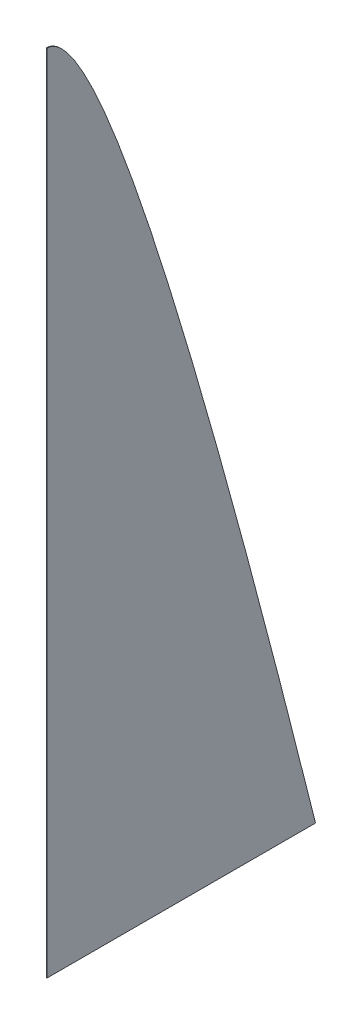
ISO-10303-21;
HEADER;
FILE_DESCRIPTION(('STEP AP214'),'2;1');
FILE_NAME('part.step','',(''),(''),'','','');
FILE_SCHEMA(('AUTOMOTIVE_DESIGN { 1 0 10303 214 1 1 1 1 }'));
ENDSEC;
DATA;
#1=APPLICATION_CONTEXT('core data for automotive mechanical design processes');
#2=APPLICATION_PROTOCOL_DEFINITION('international standard','automotive_design',2000,#1);
#3=PRODUCT_CONTEXT('',#1,'mechanical');
#4=PRODUCT('Part','Part','',(#3));
#5=PRODUCT_RELATED_PRODUCT_CATEGORY('part','',(#4));
#6=PRODUCT_DEFINITION_FORMATION('','',#4);
#7=PRODUCT_DEFINITION_CONTEXT('part definition',#1,'design');
#8=PRODUCT_DEFINITION('design','',#6,#7);
#9=PRODUCT_DEFINITION_SHAPE('','',#8);
#10=(LENGTH_UNIT() NAMED_UNIT(*) SI_UNIT(.MILLI.,.METRE.));
#11=(NAMED_UNIT(*) PLANE_ANGLE_UNIT() SI_UNIT($,.RADIAN.));
#12=(NAMED_UNIT(*) SI_UNIT($,.STERADIAN.) SOLID_ANGLE_UNIT());
#13=UNCERTAINTY_MEASURE_WITH_UNIT(LENGTH_MEASURE(1.E-05),#10,'distance_accuracy_value','');
#14=(GEOMETRIC_REPRESENTATION_CONTEXT(3) GLOBAL_UNCERTAINTY_ASSIGNED_CONTEXT((#13)) GLOBAL_UNIT_ASSIGNED_CONTEXT((#10,
#11,#12)) REPRESENTATION_CONTEXT('',''));
#15=CARTESIAN_POINT('',(0.,0.,0.));
#16=DIRECTION('',(0.,0.,1.));
#17=DIRECTION('',(1.,0.,0.));
#18=AXIS2_PLACEMENT_3D('',#15,#16,#17);
#19=CARTESIAN_POINT('',(1.,0.,-400.));
#20=DIRECTION('',(0.,1.,0.));
#21=DIRECTION('',(0.,0.,1.));
#22=AXIS2_PLACEMENT_3D('',#19,#20,#21);
#23=PLANE('',#22);
#24=DIRECTION('',(0.,0.,-1.));
#25=VECTOR('',#24,1.);
#26=CARTESIAN_POINT('',(0.,0.,-400.));
#27=LINE('',#26,#25);
#28=CARTESIAN_POINT('',(0.,0.,0.));
#29=VERTEX_POINT('',#28);
#30=CARTESIAN_POINT('',(0.,0.,-400.));
#31=VERTEX_POINT('',#30);
#32=EDGE_CURVE('E82',#29,#31,#27,.T.);
#33=ORIENTED_EDGE('',*,*,#32,.T.);
#34=DIRECTION('',(-1.,0.,0.));
#35=VECTOR('',#34,1.);
#36=CARTESIAN_POINT('',(1.,0.,-400.));
#37=LINE('',#36,#35);
#38=CARTESIAN_POINT('',(1.,0.,-400.));
#39=VERTEX_POINT('',#38);
#40=EDGE_CURVE('E11',#39,#31,#37,.T.);
#41=ORIENTED_EDGE('',*,*,#40,.F.);
#42=DIRECTION('',(0.,0.,-1.));
#43=VECTOR('',#42,1.);
#44=CARTESIAN_POINT('',(1.,0.,-400.));
#45=LINE('',#44,#43);
#46=CARTESIAN_POINT('',(1.,0.,0.));
#47=VERTEX_POINT('',#46);
#48=EDGE_CURVE('E75',#47,#39,#45,.T.);
#49=ORIENTED_EDGE('',*,*,#48,.F.);
#50=DIRECTION('',(-1.,0.,0.));
#51=VECTOR('',#50,1.);
#52=CARTESIAN_POINT('',(1.,0.,0.));
#53=LINE('',#52,#51);
#54=EDGE_CURVE('E83',#47,#29,#53,.T.);
#55=ORIENTED_EDGE('',*,*,#54,.T.);
#56=EDGE_LOOP('',(#33,#41,#49,#55));
#57=FACE_BOUND('',#56,.T.);
#58=ADVANCED_FACE('F35',(#57),#23,.F.);
#59=CARTESIAN_POINT('',(1.,0.,-400.));
#60=CARTESIAN_POINT('',(1.,1200.,-100.));
#61=CARTESIAN_POINT('',(1.,1200.,0.));
#62=B_SPLINE_CURVE_WITH_KNOTS('',2,(#59,#60,#61),.UNSPECIFIED.,.F.,.F.,(3,3),(0.,1.),.UNSPECIFIED.);
#63=DIRECTION('',(-1.,0.,0.));
#64=VECTOR('',#63,1.);
#65=SURFACE_OF_LINEAR_EXTRUSION('',#62,#64);
#66=CARTESIAN_POINT('',(0.,0.,-400.));
#67=CARTESIAN_POINT('',(0.,1200.,-100.));
#68=CARTESIAN_POINT('',(0.,1200.,0.));
#69=B_SPLINE_CURVE_WITH_KNOTS('',2,(#66,#67,#68),.UNSPECIFIED.,.F.,.F.,(3,3),(0.,1.),.UNSPECIFIED.);
#70=CARTESIAN_POINT('',(0.,1200.,0.));
#71=VERTEX_POINT('',#70);
#72=EDGE_CURVE('E63',#31,#71,#69,.T.);
#73=ORIENTED_EDGE('',*,*,#72,.T.);
#74=DIRECTION('',(-1.,0.,0.));
#75=VECTOR('',#74,1.);
#76=CARTESIAN_POINT('',(1.,1200.,0.));
#77=LINE('',#76,#75);
#78=CARTESIAN_POINT('',(1.,1200.,0.));
#79=VERTEX_POINT('',#78);
#80=EDGE_CURVE('E43',#79,#71,#77,.T.);
#81=ORIENTED_EDGE('',*,*,#80,.F.);
#82=EDGE_CURVE('E71',#39,#79,#62,.T.);
#83=ORIENTED_EDGE('',*,*,#82,.F.);
#84=ORIENTED_EDGE('',*,*,#40,.T.);
#85=EDGE_LOOP('',(#73,#81,#83,#84));
#86=FACE_BOUND('',#85,.T.);
#87=ADVANCED_FACE('F72',(#86),#65,.F.);
#88=CARTESIAN_POINT('',(1.,0.,0.));
#89=DIRECTION('',(0.,0.,-1.));
#90=DIRECTION('',(-1.,0.,0.));
#91=AXIS2_PLACEMENT_3D('',#88,#89,#90);
#92=PLANE('',#91);
#93=DIRECTION('',(0.,-1.,0.));
#94=VECTOR('',#93,1.);
#95=CARTESIAN_POINT('',(0.,0.,0.));
#96=LINE('',#95,#94);
#97=EDGE_CURVE('E68',#71,#29,#96,.T.);
#98=ORIENTED_EDGE('',*,*,#97,.T.);
#99=ORIENTED_EDGE('',*,*,#54,.F.);
#100=DIRECTION('',(0.,-1.,0.));
#101=VECTOR('',#100,1.);
#102=CARTESIAN_POINT('',(1.,0.,0.));
#103=LINE('',#102,#101);
#104=EDGE_CURVE('E51',#79,#47,#103,.T.);
#105=ORIENTED_EDGE('',*,*,#104,.F.);
#106=ORIENTED_EDGE('',*,*,#80,.T.);
#107=EDGE_LOOP('',(#98,#99,#105,#106));
#108=FACE_BOUND('',#107,.T.);
#109=ADVANCED_FACE('F95',(#108),#92,.F.);
#110=CARTESIAN_POINT('',(1.,900.,-150.));
#111=DIRECTION('',(1.,0.,0.));
#112=DIRECTION('',(0.,0.,-1.));
#113=AXIS2_PLACEMENT_3D('',#110,#111,#112);
#114=PLANE('',#113);
#115=ORIENTED_EDGE('',*,*,#48,.T.);
#116=ORIENTED_EDGE('',*,*,#82,.T.);
#117=ORIENTED_EDGE('',*,*,#104,.T.);
#118=EDGE_LOOP('',(#115,#116,#117));
#119=FACE_BOUND('',#118,.T.);
#120=ADVANCED_FACE('F78',(#119),#114,.T.);
#121=CARTESIAN_POINT('',(0.,900.,-150.));
#122=DIRECTION('',(1.,0.,0.));
#123=DIRECTION('',(0.,0.,-1.));
#124=AXIS2_PLACEMENT_3D('',#121,#122,#123);
#125=PLANE('',#124);
#126=ORIENTED_EDGE('',*,*,#32,.F.);
#127=ORIENTED_EDGE('',*,*,#97,.F.);
#128=ORIENTED_EDGE('',*,*,#72,.F.);
#129=EDGE_LOOP('',(#126,#127,#128));
#130=FACE_BOUND('',#129,.T.);
#131=ADVANCED_FACE('F96',(#130),#125,.F.);
#132=CLOSED_SHELL('',(#58,#87,#109,#120,#131));
#133=MANIFOLD_SOLID_BREP('B2',#132);
#134=ADVANCED_BREP_SHAPE_REPRESENTATION('',(#18,#133),#14);
#135=SHAPE_DEFINITION_REPRESENTATION(#9,#134);
ENDSEC;
END-ISO-10303-21;
